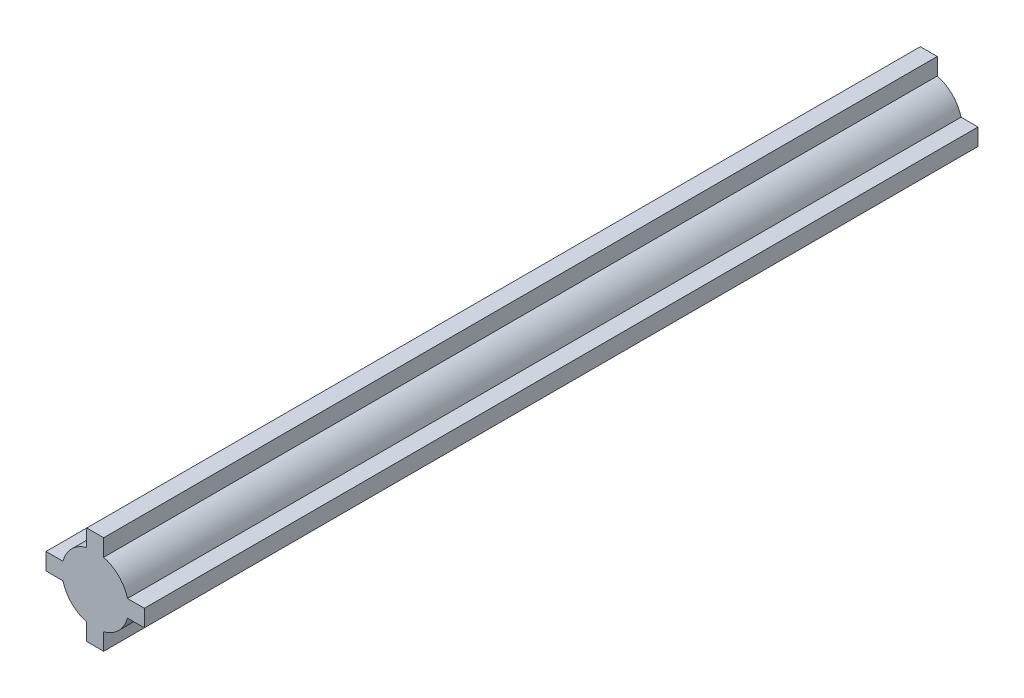
ISO-10303-21;
HEADER;
FILE_DESCRIPTION(('STEP AP214'),'2;1');
FILE_NAME('part.step','',(''),(''),'','','');
FILE_SCHEMA(('AUTOMOTIVE_DESIGN { 1 0 10303 214 1 1 1 1 }'));
ENDSEC;
DATA;
#1=APPLICATION_CONTEXT('core data for automotive mechanical design processes');
#2=APPLICATION_PROTOCOL_DEFINITION('international standard','automotive_design',2000,#1);
#3=PRODUCT_CONTEXT('',#1,'mechanical');
#4=PRODUCT('Part','Part','',(#3));
#5=PRODUCT_RELATED_PRODUCT_CATEGORY('part','',(#4));
#6=PRODUCT_DEFINITION_FORMATION('','',#4);
#7=PRODUCT_DEFINITION_CONTEXT('part definition',#1,'design');
#8=PRODUCT_DEFINITION('design','',#6,#7);
#9=PRODUCT_DEFINITION_SHAPE('','',#8);
#10=(LENGTH_UNIT() NAMED_UNIT(*) SI_UNIT(.MILLI.,.METRE.));
#11=(NAMED_UNIT(*) PLANE_ANGLE_UNIT() SI_UNIT($,.RADIAN.));
#12=(NAMED_UNIT(*) SI_UNIT($,.STERADIAN.) SOLID_ANGLE_UNIT());
#13=UNCERTAINTY_MEASURE_WITH_UNIT(LENGTH_MEASURE(1.E-05),#10,'distance_accuracy_value','');
#14=(GEOMETRIC_REPRESENTATION_CONTEXT(3) GLOBAL_UNCERTAINTY_ASSIGNED_CONTEXT((#13)) GLOBAL_UNIT_ASSIGNED_CONTEXT((#10,
#11,#12)) REPRESENTATION_CONTEXT('',''));
#15=CARTESIAN_POINT('',(0.,0.,0.));
#16=DIRECTION('',(0.,0.,1.));
#17=DIRECTION('',(1.,0.,0.));
#18=AXIS2_PLACEMENT_3D('',#15,#16,#17);
#19=CARTESIAN_POINT('',(0.,0.,12.5));
#20=DIRECTION('',(0.,0.,-1.));
#21=DIRECTION('',(-1.,0.,0.));
#22=AXIS2_PLACEMENT_3D('',#19,#20,#21);
#23=CYLINDRICAL_SURFACE('',#22,1.);
#24=CARTESIAN_POINT('',(0.,0.,-12.5));
#25=DIRECTION('',(0.,0.,1.));
#26=DIRECTION('',(1.,0.,0.));
#27=AXIS2_PLACEMENT_3D('',#24,#25,#26);
#28=CIRCLE('',#27,1.);
#29=CARTESIAN_POINT('',(0.967204218353084,0.254,-12.5));
#30=VERTEX_POINT('',#29);
#31=CARTESIAN_POINT('',(0.254,0.967204218353084,-12.5));
#32=VERTEX_POINT('',#31);
#33=EDGE_CURVE('E379',#30,#32,#28,.T.);
#34=ORIENTED_EDGE('',*,*,#33,.T.);
#35=DIRECTION('',(0.,0.,-1.));
#36=VECTOR('',#35,1.);
#37=CARTESIAN_POINT('',(0.254,0.967204218353084,12.5));
#38=LINE('',#37,#36);
#39=CARTESIAN_POINT('',(0.254,0.967204218353084,12.5));
#40=VERTEX_POINT('',#39);
#41=EDGE_CURVE('E216',#40,#32,#38,.T.);
#42=ORIENTED_EDGE('',*,*,#41,.F.);
#43=CARTESIAN_POINT('',(0.,0.,12.5));
#44=DIRECTION('',(0.,0.,1.));
#45=DIRECTION('',(1.,0.,0.));
#46=AXIS2_PLACEMENT_3D('',#43,#44,#45);
#47=CIRCLE('',#46,1.);
#48=CARTESIAN_POINT('',(0.967204218353084,0.254,12.5));
#49=VERTEX_POINT('',#48);
#50=EDGE_CURVE('E415',#49,#40,#47,.T.);
#51=ORIENTED_EDGE('',*,*,#50,.F.);
#52=DIRECTION('',(0.,0.,-1.));
#53=VECTOR('',#52,1.);
#54=CARTESIAN_POINT('',(0.967204218353084,0.254,12.5));
#55=LINE('',#54,#53);
#56=EDGE_CURVE('E12',#49,#30,#55,.T.);
#57=ORIENTED_EDGE('',*,*,#56,.T.);
#58=EDGE_LOOP('',(#34,#42,#51,#57));
#59=FACE_BOUND('',#58,.T.);
#60=ADVANCED_FACE('F206',(#59),#23,.T.);
#61=CARTESIAN_POINT('',(-0.254,0.967204218353084,-12.5));
#62=VERTEX_POINT('',#61);
#63=CARTESIAN_POINT('',(-0.967204218353084,0.254,-12.5));
#64=VERTEX_POINT('',#63);
#65=EDGE_CURVE('E413',#62,#64,#28,.T.);
#66=ORIENTED_EDGE('',*,*,#65,.T.);
#67=DIRECTION('',(0.,0.,-1.));
#68=VECTOR('',#67,1.);
#69=CARTESIAN_POINT('',(-0.967204218353084,0.254,12.5));
#70=LINE('',#69,#68);
#71=CARTESIAN_POINT('',(-0.967204218353084,0.254,12.5));
#72=VERTEX_POINT('',#71);
#73=EDGE_CURVE('E401',#72,#64,#70,.T.);
#74=ORIENTED_EDGE('',*,*,#73,.F.);
#75=CARTESIAN_POINT('',(-0.254,0.967204218353084,12.5));
#76=VERTEX_POINT('',#75);
#77=EDGE_CURVE('E417',#76,#72,#47,.T.);
#78=ORIENTED_EDGE('',*,*,#77,.F.);
#79=DIRECTION('',(0.,0.,-1.));
#80=VECTOR('',#79,1.);
#81=CARTESIAN_POINT('',(-0.254,0.967204218353084,12.5));
#82=LINE('',#81,#80);
#83=EDGE_CURVE('E399',#76,#62,#82,.T.);
#84=ORIENTED_EDGE('',*,*,#83,.T.);
#85=EDGE_LOOP('',(#66,#74,#78,#84));
#86=FACE_BOUND('',#85,.T.);
#87=ADVANCED_FACE('F469',(#86),#23,.T.);
#88=CARTESIAN_POINT('',(-0.967204218353084,-0.254,-12.5));
#89=VERTEX_POINT('',#88);
#90=CARTESIAN_POINT('',(-0.254,-0.967204218353084,-12.5));
#91=VERTEX_POINT('',#90);
#92=EDGE_CURVE('E424',#89,#91,#28,.T.);
#93=ORIENTED_EDGE('',*,*,#92,.T.);
#94=DIRECTION('',(0.,0.,-1.));
#95=VECTOR('',#94,1.);
#96=CARTESIAN_POINT('',(-0.254,-0.967204218353084,12.5));
#97=LINE('',#96,#95);
#98=CARTESIAN_POINT('',(-0.254,-0.967204218353084,12.5));
#99=VERTEX_POINT('',#98);
#100=EDGE_CURVE('E405',#99,#91,#97,.T.);
#101=ORIENTED_EDGE('',*,*,#100,.F.);
#102=CARTESIAN_POINT('',(-0.967204218353084,-0.254,12.5));
#103=VERTEX_POINT('',#102);
#104=EDGE_CURVE('E423',#103,#99,#47,.T.);
#105=ORIENTED_EDGE('',*,*,#104,.F.);
#106=DIRECTION('',(0.,0.,-1.));
#107=VECTOR('',#106,1.);
#108=CARTESIAN_POINT('',(-0.967204218353084,-0.254,12.5));
#109=LINE('',#108,#107);
#110=EDGE_CURVE('E403',#103,#89,#109,.T.);
#111=ORIENTED_EDGE('',*,*,#110,.T.);
#112=EDGE_LOOP('',(#93,#101,#105,#111));
#113=FACE_BOUND('',#112,.T.);
#114=ADVANCED_FACE('F437',(#113),#23,.T.);
#115=CARTESIAN_POINT('',(0.254,-0.967204218353084,-12.5));
#116=VERTEX_POINT('',#115);
#117=CARTESIAN_POINT('',(0.967204218353084,-0.254,-12.5));
#118=VERTEX_POINT('',#117);
#119=EDGE_CURVE('E414',#116,#118,#28,.T.);
#120=ORIENTED_EDGE('',*,*,#119,.T.);
#121=DIRECTION('',(0.,0.,-1.));
#122=VECTOR('',#121,1.);
#123=CARTESIAN_POINT('',(0.967204218353084,-0.254,12.5));
#124=LINE('',#123,#122);
#125=CARTESIAN_POINT('',(0.967204218353084,-0.254,12.5));
#126=VERTEX_POINT('',#125);
#127=EDGE_CURVE('E225',#126,#118,#124,.T.);
#128=ORIENTED_EDGE('',*,*,#127,.F.);
#129=CARTESIAN_POINT('',(0.254,-0.967204218353084,12.5));
#130=VERTEX_POINT('',#129);
#131=EDGE_CURVE('E410',#130,#126,#47,.T.);
#132=ORIENTED_EDGE('',*,*,#131,.F.);
#133=DIRECTION('',(0.,0.,-1.));
#134=VECTOR('',#133,1.);
#135=CARTESIAN_POINT('',(0.254,-0.967204218353084,12.5));
#136=LINE('',#135,#134);
#137=EDGE_CURVE('E407',#130,#116,#136,.T.);
#138=ORIENTED_EDGE('',*,*,#137,.T.);
#139=EDGE_LOOP('',(#120,#128,#132,#138));
#140=FACE_BOUND('',#139,.T.);
#141=ADVANCED_FACE('F495',(#140),#23,.T.);
#142=CARTESIAN_POINT('',(0.,0.,-12.5));
#143=DIRECTION('',(0.,0.,1.));
#144=DIRECTION('',(1.,0.,0.));
#145=AXIS2_PLACEMENT_3D('',#142,#143,#144);
#146=PLANE('',#145);
#147=ORIENTED_EDGE('',*,*,#33,.F.);
#148=DIRECTION('',(1.,0.,0.));
#149=VECTOR('',#148,1.);
#150=CARTESIAN_POINT('',(0.967204218353084,0.254,-12.5));
#151=LINE('',#150,#149);
#152=CARTESIAN_POINT('',(1.47520421835308,0.254,-12.5));
#153=VERTEX_POINT('',#152);
#154=EDGE_CURVE('E325',#30,#153,#151,.T.);
#155=ORIENTED_EDGE('',*,*,#154,.T.);
#156=DIRECTION('',(0.,-1.,0.));
#157=VECTOR('',#156,1.);
#158=CARTESIAN_POINT('',(1.47520421835308,0.254,-12.5));
#159=LINE('',#158,#157);
#160=CARTESIAN_POINT('',(1.47520421835308,-0.254,-12.5));
#161=VERTEX_POINT('',#160);
#162=EDGE_CURVE('E310',#153,#161,#159,.T.);
#163=ORIENTED_EDGE('',*,*,#162,.T.);
#164=DIRECTION('',(1.,0.,0.));
#165=VECTOR('',#164,1.);
#166=CARTESIAN_POINT('',(0.967204218353084,-0.254,-12.5));
#167=LINE('',#166,#165);
#168=EDGE_CURVE('E317',#118,#161,#167,.T.);
#169=ORIENTED_EDGE('',*,*,#168,.F.);
#170=ORIENTED_EDGE('',*,*,#119,.F.);
#171=DIRECTION('',(0.,-1.,0.));
#172=VECTOR('',#171,1.);
#173=CARTESIAN_POINT('',(0.254,-0.967204218353084,-12.5));
#174=LINE('',#173,#172);
#175=CARTESIAN_POINT('',(0.254,-1.47520421835308,-12.5));
#176=VERTEX_POINT('',#175);
#177=EDGE_CURVE('E340',#116,#176,#174,.T.);
#178=ORIENTED_EDGE('',*,*,#177,.T.);
#179=DIRECTION('',(1.,0.,0.));
#180=VECTOR('',#179,1.);
#181=CARTESIAN_POINT('',(-0.254,-1.47520421835308,-12.5));
#182=LINE('',#181,#180);
#183=CARTESIAN_POINT('',(-0.254,-1.47520421835308,-12.5));
#184=VERTEX_POINT('',#183);
#185=EDGE_CURVE('E344',#184,#176,#182,.T.);
#186=ORIENTED_EDGE('',*,*,#185,.F.);
#187=DIRECTION('',(0.,-1.,0.));
#188=VECTOR('',#187,1.);
#189=CARTESIAN_POINT('',(-0.254,-0.967204218353084,-12.5));
#190=LINE('',#189,#188);
#191=EDGE_CURVE('E315',#91,#184,#190,.T.);
#192=ORIENTED_EDGE('',*,*,#191,.F.);
#193=ORIENTED_EDGE('',*,*,#92,.F.);
#194=DIRECTION('',(-1.,0.,0.));
#195=VECTOR('',#194,1.);
#196=CARTESIAN_POINT('',(-0.967204218353084,-0.254,-12.5));
#197=LINE('',#196,#195);
#198=CARTESIAN_POINT('',(-1.47520421835308,-0.254,-12.5));
#199=VERTEX_POINT('',#198);
#200=EDGE_CURVE('E362',#89,#199,#197,.T.);
#201=ORIENTED_EDGE('',*,*,#200,.T.);
#202=DIRECTION('',(0.,-1.,0.));
#203=VECTOR('',#202,1.);
#204=CARTESIAN_POINT('',(-1.47520421835308,0.254,-12.5));
#205=LINE('',#204,#203);
#206=CARTESIAN_POINT('',(-1.47520421835308,0.254,-12.5));
#207=VERTEX_POINT('',#206);
#208=EDGE_CURVE('E366',#207,#199,#205,.T.);
#209=ORIENTED_EDGE('',*,*,#208,.F.);
#210=DIRECTION('',(-1.,0.,0.));
#211=VECTOR('',#210,1.);
#212=CARTESIAN_POINT('',(-0.967204218353084,0.254,-12.5));
#213=LINE('',#212,#211);
#214=EDGE_CURVE('E336',#64,#207,#213,.T.);
#215=ORIENTED_EDGE('',*,*,#214,.F.);
#216=ORIENTED_EDGE('',*,*,#65,.F.);
#217=DIRECTION('',(0.,1.,0.));
#218=VECTOR('',#217,1.);
#219=CARTESIAN_POINT('',(-0.254,0.,-12.5));
#220=LINE('',#219,#218);
#221=CARTESIAN_POINT('',(-0.254,1.47520421835308,-12.5));
#222=VERTEX_POINT('',#221);
#223=EDGE_CURVE('E383',#62,#222,#220,.T.);
#224=ORIENTED_EDGE('',*,*,#223,.T.);
#225=DIRECTION('',(1.,0.,0.));
#226=VECTOR('',#225,1.);
#227=CARTESIAN_POINT('',(0.,1.47520421835308,-12.5));
#228=LINE('',#227,#226);
#229=CARTESIAN_POINT('',(0.254,1.47520421835308,-12.5));
#230=VERTEX_POINT('',#229);
#231=EDGE_CURVE('E387',#222,#230,#228,.T.);
#232=ORIENTED_EDGE('',*,*,#231,.T.);
#233=DIRECTION('',(0.,1.,0.));
#234=VECTOR('',#233,1.);
#235=CARTESIAN_POINT('',(0.254,0.,-12.5));
#236=LINE('',#235,#234);
#237=EDGE_CURVE('E358',#32,#230,#236,.T.);
#238=ORIENTED_EDGE('',*,*,#237,.F.);
#239=EDGE_LOOP('',(#147,#155,#163,#169,#170,#178,#186,#192,#193,#201,#209,#215,#216,#224,#232,#238));
#240=FACE_BOUND('',#239,.T.);
#241=ADVANCED_FACE('F324',(#240),#146,.F.);
#242=CARTESIAN_POINT('',(0.,0.,12.5));
#243=DIRECTION('',(0.,0.,1.));
#244=DIRECTION('',(1.,0.,0.));
#245=AXIS2_PLACEMENT_3D('',#242,#243,#244);
#246=PLANE('',#245);
#247=ORIENTED_EDGE('',*,*,#131,.T.);
#248=DIRECTION('',(1.,0.,0.));
#249=VECTOR('',#248,1.);
#250=CARTESIAN_POINT('',(0.967204218353084,-0.254,12.5));
#251=LINE('',#250,#249);
#252=CARTESIAN_POINT('',(1.47520421835308,-0.254,12.5));
#253=VERTEX_POINT('',#252);
#254=EDGE_CURVE('E329',#126,#253,#251,.T.);
#255=ORIENTED_EDGE('',*,*,#254,.T.);
#256=DIRECTION('',(0.,-1.,0.));
#257=VECTOR('',#256,1.);
#258=CARTESIAN_POINT('',(1.47520421835308,0.254,12.5));
#259=LINE('',#258,#257);
#260=CARTESIAN_POINT('',(1.47520421835308,0.254,12.5));
#261=VERTEX_POINT('',#260);
#262=EDGE_CURVE('E313',#261,#253,#259,.T.);
#263=ORIENTED_EDGE('',*,*,#262,.F.);
#264=DIRECTION('',(1.,0.,0.));
#265=VECTOR('',#264,1.);
#266=CARTESIAN_POINT('',(0.967204218353084,0.254,12.5));
#267=LINE('',#266,#265);
#268=EDGE_CURVE('E321',#49,#261,#267,.T.);
#269=ORIENTED_EDGE('',*,*,#268,.F.);
#270=ORIENTED_EDGE('',*,*,#50,.T.);
#271=DIRECTION('',(0.,1.,0.));
#272=VECTOR('',#271,1.);
#273=CARTESIAN_POINT('',(0.254,0.,12.5));
#274=LINE('',#273,#272);
#275=CARTESIAN_POINT('',(0.254,1.47520421835308,12.5));
#276=VERTEX_POINT('',#275);
#277=EDGE_CURVE('E386',#40,#276,#274,.T.);
#278=ORIENTED_EDGE('',*,*,#277,.T.);
#279=DIRECTION('',(1.,0.,0.));
#280=VECTOR('',#279,1.);
#281=CARTESIAN_POINT('',(0.,1.47520421835308,12.5));
#282=LINE('',#281,#280);
#283=CARTESIAN_POINT('',(-0.254,1.47520421835308,12.5));
#284=VERTEX_POINT('',#283);
#285=EDGE_CURVE('E394',#284,#276,#282,.T.);
#286=ORIENTED_EDGE('',*,*,#285,.F.);
#287=DIRECTION('',(0.,1.,0.));
#288=VECTOR('',#287,1.);
#289=CARTESIAN_POINT('',(-0.254,0.,12.5));
#290=LINE('',#289,#288);
#291=EDGE_CURVE('E382',#76,#284,#290,.T.);
#292=ORIENTED_EDGE('',*,*,#291,.F.);
#293=ORIENTED_EDGE('',*,*,#77,.T.);
#294=DIRECTION('',(-1.,0.,0.));
#295=VECTOR('',#294,1.);
#296=CARTESIAN_POINT('',(-0.967204218353084,0.254,12.5));
#297=LINE('',#296,#295);
#298=CARTESIAN_POINT('',(-1.47520421835308,0.254,12.5));
#299=VERTEX_POINT('',#298);
#300=EDGE_CURVE('E365',#72,#299,#297,.T.);
#301=ORIENTED_EDGE('',*,*,#300,.T.);
#302=DIRECTION('',(0.,-1.,0.));
#303=VECTOR('',#302,1.);
#304=CARTESIAN_POINT('',(-1.47520421835308,0.254,12.5));
#305=LINE('',#304,#303);
#306=CARTESIAN_POINT('',(-1.47520421835308,-0.254,12.5));
#307=VERTEX_POINT('',#306);
#308=EDGE_CURVE('E373',#299,#307,#305,.T.);
#309=ORIENTED_EDGE('',*,*,#308,.T.);
#310=DIRECTION('',(-1.,0.,0.));
#311=VECTOR('',#310,1.);
#312=CARTESIAN_POINT('',(-0.967204218353084,-0.254,12.5));
#313=LINE('',#312,#311);
#314=EDGE_CURVE('E361',#103,#307,#313,.T.);
#315=ORIENTED_EDGE('',*,*,#314,.F.);
#316=ORIENTED_EDGE('',*,*,#104,.T.);
#317=DIRECTION('',(0.,-1.,0.));
#318=VECTOR('',#317,1.);
#319=CARTESIAN_POINT('',(-0.254,-0.967204218353084,12.5));
#320=LINE('',#319,#318);
#321=CARTESIAN_POINT('',(-0.254,-1.47520421835308,12.5));
#322=VERTEX_POINT('',#321);
#323=EDGE_CURVE('E343',#99,#322,#320,.T.);
#324=ORIENTED_EDGE('',*,*,#323,.T.);
#325=DIRECTION('',(1.,0.,0.));
#326=VECTOR('',#325,1.);
#327=CARTESIAN_POINT('',(-0.254,-1.47520421835308,12.5));
#328=LINE('',#327,#326);
#329=CARTESIAN_POINT('',(0.254,-1.47520421835308,12.5));
#330=VERTEX_POINT('',#329);
#331=EDGE_CURVE('E351',#322,#330,#328,.T.);
#332=ORIENTED_EDGE('',*,*,#331,.T.);
#333=DIRECTION('',(0.,-1.,0.));
#334=VECTOR('',#333,1.);
#335=CARTESIAN_POINT('',(0.254,-0.967204218353084,12.5));
#336=LINE('',#335,#334);
#337=EDGE_CURVE('E339',#130,#330,#336,.T.);
#338=ORIENTED_EDGE('',*,*,#337,.F.);
#339=EDGE_LOOP('',(#247,#255,#263,#269,#270,#278,#286,#292,#293,#301,#309,#315,#316,#324,#332,#338));
#340=FACE_BOUND('',#339,.T.);
#341=ADVANCED_FACE('F430',(#340),#246,.T.);
#342=CARTESIAN_POINT('',(0.,1.47520421835308,12.5));
#343=DIRECTION('',(0.,1.,0.));
#344=DIRECTION('',(0.,0.,1.));
#345=AXIS2_PLACEMENT_3D('',#342,#343,#344);
#346=PLANE('',#345);
#347=ORIENTED_EDGE('',*,*,#231,.F.);
#348=DIRECTION('',(0.,0.,-1.));
#349=VECTOR('',#348,1.);
#350=CARTESIAN_POINT('',(-0.254,1.47520421835308,12.5));
#351=LINE('',#350,#349);
#352=EDGE_CURVE('E380',#284,#222,#351,.T.);
#353=ORIENTED_EDGE('',*,*,#352,.F.);
#354=ORIENTED_EDGE('',*,*,#285,.T.);
#355=DIRECTION('',(0.,0.,-1.));
#356=VECTOR('',#355,1.);
#357=CARTESIAN_POINT('',(0.254,1.47520421835308,12.5));
#358=LINE('',#357,#356);
#359=EDGE_CURVE('E377',#276,#230,#358,.T.);
#360=ORIENTED_EDGE('',*,*,#359,.T.);
#361=EDGE_LOOP('',(#347,#353,#354,#360));
#362=FACE_BOUND('',#361,.T.);
#363=ADVANCED_FACE('F512',(#362),#346,.T.);
#364=CARTESIAN_POINT('',(-0.254,0.,12.5));
#365=DIRECTION('',(-1.,0.,0.));
#366=DIRECTION('',(0.,-1.,0.));
#367=AXIS2_PLACEMENT_3D('',#364,#365,#366);
#368=PLANE('',#367);
#369=ORIENTED_EDGE('',*,*,#223,.F.);
#370=ORIENTED_EDGE('',*,*,#83,.F.);
#371=ORIENTED_EDGE('',*,*,#291,.T.);
#372=ORIENTED_EDGE('',*,*,#352,.T.);
#373=EDGE_LOOP('',(#369,#370,#371,#372));
#374=FACE_BOUND('',#373,.T.);
#375=ADVANCED_FACE('F464',(#374),#368,.T.);
#376=CARTESIAN_POINT('',(0.254,0.,12.5));
#377=DIRECTION('',(-1.,0.,0.));
#378=DIRECTION('',(0.,-1.,0.));
#379=AXIS2_PLACEMENT_3D('',#376,#377,#378);
#380=PLANE('',#379);
#381=ORIENTED_EDGE('',*,*,#237,.T.);
#382=ORIENTED_EDGE('',*,*,#359,.F.);
#383=ORIENTED_EDGE('',*,*,#277,.F.);
#384=ORIENTED_EDGE('',*,*,#41,.T.);
#385=EDGE_LOOP('',(#381,#382,#383,#384));
#386=FACE_BOUND('',#385,.T.);
#387=ADVANCED_FACE('F457',(#386),#380,.F.);
#388=CARTESIAN_POINT('',(0.254,-0.967204218353084,12.5));
#389=DIRECTION('',(1.,0.,0.));
#390=DIRECTION('',(0.,1.,0.));
#391=AXIS2_PLACEMENT_3D('',#388,#389,#390);
#392=PLANE('',#391);
#393=ORIENTED_EDGE('',*,*,#177,.F.);
#394=ORIENTED_EDGE('',*,*,#137,.F.);
#395=ORIENTED_EDGE('',*,*,#337,.T.);
#396=DIRECTION('',(0.,0.,-1.));
#397=VECTOR('',#396,1.);
#398=CARTESIAN_POINT('',(0.254,-1.47520421835308,12.5));
#399=LINE('',#398,#397);
#400=EDGE_CURVE('E337',#330,#176,#399,.T.);
#401=ORIENTED_EDGE('',*,*,#400,.T.);
#402=EDGE_LOOP('',(#393,#394,#395,#401));
#403=FACE_BOUND('',#402,.T.);
#404=ADVANCED_FACE('F509',(#403),#392,.T.);
#405=CARTESIAN_POINT('',(-0.254,-1.47520421835308,12.5));
#406=DIRECTION('',(0.,1.,0.));
#407=DIRECTION('',(0.,0.,1.));
#408=AXIS2_PLACEMENT_3D('',#405,#406,#407);
#409=PLANE('',#408);
#410=ORIENTED_EDGE('',*,*,#185,.T.);
#411=ORIENTED_EDGE('',*,*,#400,.F.);
#412=ORIENTED_EDGE('',*,*,#331,.F.);
#413=DIRECTION('',(0.,0.,-1.));
#414=VECTOR('',#413,1.);
#415=CARTESIAN_POINT('',(-0.254,-1.47520421835308,12.5));
#416=LINE('',#415,#414);
#417=EDGE_CURVE('E333',#322,#184,#416,.T.);
#418=ORIENTED_EDGE('',*,*,#417,.T.);
#419=EDGE_LOOP('',(#410,#411,#412,#418));
#420=FACE_BOUND('',#419,.T.);
#421=ADVANCED_FACE('F488',(#420),#409,.F.);
#422=CARTESIAN_POINT('',(-0.254,-0.967204218353084,12.5));
#423=DIRECTION('',(1.,0.,0.));
#424=DIRECTION('',(0.,1.,0.));
#425=AXIS2_PLACEMENT_3D('',#422,#423,#424);
#426=PLANE('',#425);
#427=ORIENTED_EDGE('',*,*,#191,.T.);
#428=ORIENTED_EDGE('',*,*,#417,.F.);
#429=ORIENTED_EDGE('',*,*,#323,.F.);
#430=ORIENTED_EDGE('',*,*,#100,.T.);
#431=EDGE_LOOP('',(#427,#428,#429,#430));
#432=FACE_BOUND('',#431,.T.);
#433=ADVANCED_FACE('F481',(#432),#426,.F.);
#434=CARTESIAN_POINT('',(-0.967204218353084,-0.254,12.5));
#435=DIRECTION('',(0.,-1.,0.));
#436=DIRECTION('',(1.,0.,0.));
#437=AXIS2_PLACEMENT_3D('',#434,#435,#436);
#438=PLANE('',#437);
#439=ORIENTED_EDGE('',*,*,#200,.F.);
#440=ORIENTED_EDGE('',*,*,#110,.F.);
#441=ORIENTED_EDGE('',*,*,#314,.T.);
#442=DIRECTION('',(0.,0.,-1.));
#443=VECTOR('',#442,1.);
#444=CARTESIAN_POINT('',(-1.47520421835308,-0.254,12.5));
#445=LINE('',#444,#443);
#446=EDGE_CURVE('E359',#307,#199,#445,.T.);
#447=ORIENTED_EDGE('',*,*,#446,.T.);
#448=EDGE_LOOP('',(#439,#440,#441,#447));
#449=FACE_BOUND('',#448,.T.);
#450=ADVANCED_FACE('F478',(#449),#438,.T.);
#451=CARTESIAN_POINT('',(-1.47520421835308,0.254,12.5));
#452=DIRECTION('',(1.,0.,0.));
#453=DIRECTION('',(0.,0.,-1.));
#454=AXIS2_PLACEMENT_3D('',#451,#452,#453);
#455=PLANE('',#454);
#456=ORIENTED_EDGE('',*,*,#208,.T.);
#457=ORIENTED_EDGE('',*,*,#446,.F.);
#458=ORIENTED_EDGE('',*,*,#308,.F.);
#459=DIRECTION('',(0.,0.,-1.));
#460=VECTOR('',#459,1.);
#461=CARTESIAN_POINT('',(-1.47520421835308,0.254,12.5));
#462=LINE('',#461,#460);
#463=EDGE_CURVE('E355',#299,#207,#462,.T.);
#464=ORIENTED_EDGE('',*,*,#463,.T.);
#465=EDGE_LOOP('',(#456,#457,#458,#464));
#466=FACE_BOUND('',#465,.T.);
#467=ADVANCED_FACE('F477',(#466),#455,.F.);
#468=CARTESIAN_POINT('',(-0.967204218353084,0.254,12.5));
#469=DIRECTION('',(0.,-1.,0.));
#470=DIRECTION('',(1.,0.,0.));
#471=AXIS2_PLACEMENT_3D('',#468,#469,#470);
#472=PLANE('',#471);
#473=ORIENTED_EDGE('',*,*,#214,.T.);
#474=ORIENTED_EDGE('',*,*,#463,.F.);
#475=ORIENTED_EDGE('',*,*,#300,.F.);
#476=ORIENTED_EDGE('',*,*,#73,.T.);
#477=EDGE_LOOP('',(#473,#474,#475,#476));
#478=FACE_BOUND('',#477,.T.);
#479=ADVANCED_FACE('F474',(#478),#472,.F.);
#480=CARTESIAN_POINT('',(0.967204218353084,0.254,12.5));
#481=DIRECTION('',(0.,1.,0.));
#482=DIRECTION('',(-1.,0.,0.));
#483=AXIS2_PLACEMENT_3D('',#480,#481,#482);
#484=PLANE('',#483);
#485=ORIENTED_EDGE('',*,*,#154,.F.);
#486=ORIENTED_EDGE('',*,*,#56,.F.);
#487=ORIENTED_EDGE('',*,*,#268,.T.);
#488=DIRECTION('',(0.,0.,-1.));
#489=VECTOR('',#488,1.);
#490=CARTESIAN_POINT('',(1.47520421835308,0.254,12.5));
#491=LINE('',#490,#489);
#492=EDGE_CURVE('E210',#261,#153,#491,.T.);
#493=ORIENTED_EDGE('',*,*,#492,.T.);
#494=EDGE_LOOP('',(#485,#486,#487,#493));
#495=FACE_BOUND('',#494,.T.);
#496=ADVANCED_FACE('F208',(#495),#484,.T.);
#497=CARTESIAN_POINT('',(1.47520421835308,0.254,12.5));
#498=DIRECTION('',(1.,0.,0.));
#499=DIRECTION('',(0.,0.,-1.));
#500=AXIS2_PLACEMENT_3D('',#497,#498,#499);
#501=PLANE('',#500);
#502=ORIENTED_EDGE('',*,*,#162,.F.);
#503=ORIENTED_EDGE('',*,*,#492,.F.);
#504=ORIENTED_EDGE('',*,*,#262,.T.);
#505=DIRECTION('',(0.,0.,-1.));
#506=VECTOR('',#505,1.);
#507=CARTESIAN_POINT('',(1.47520421835308,-0.254,12.5));
#508=LINE('',#507,#506);
#509=EDGE_CURVE('E306',#253,#161,#508,.T.);
#510=ORIENTED_EDGE('',*,*,#509,.T.);
#511=EDGE_LOOP('',(#502,#503,#504,#510));
#512=FACE_BOUND('',#511,.T.);
#513=ADVANCED_FACE('F308',(#512),#501,.T.);
#514=CARTESIAN_POINT('',(0.967204218353084,-0.254,12.5));
#515=DIRECTION('',(0.,1.,0.));
#516=DIRECTION('',(-1.,0.,0.));
#517=AXIS2_PLACEMENT_3D('',#514,#515,#516);
#518=PLANE('',#517);
#519=ORIENTED_EDGE('',*,*,#168,.T.);
#520=ORIENTED_EDGE('',*,*,#509,.F.);
#521=ORIENTED_EDGE('',*,*,#254,.F.);
#522=ORIENTED_EDGE('',*,*,#127,.T.);
#523=EDGE_LOOP('',(#519,#520,#521,#522));
#524=FACE_BOUND('',#523,.T.);
#525=ADVANCED_FACE('F318',(#524),#518,.F.);
#526=CLOSED_SHELL('',(#60,#87,#114,#141,#241,#341,#363,#375,#387,#404,#421,#433,#450,#467,#479,
#496,#513,#525));
#527=MANIFOLD_SOLID_BREP('B2',#526);
#528=ADVANCED_BREP_SHAPE_REPRESENTATION('',(#18,#527),#14);
#529=SHAPE_DEFINITION_REPRESENTATION(#9,#528);
ENDSEC;
END-ISO-10303-21;
